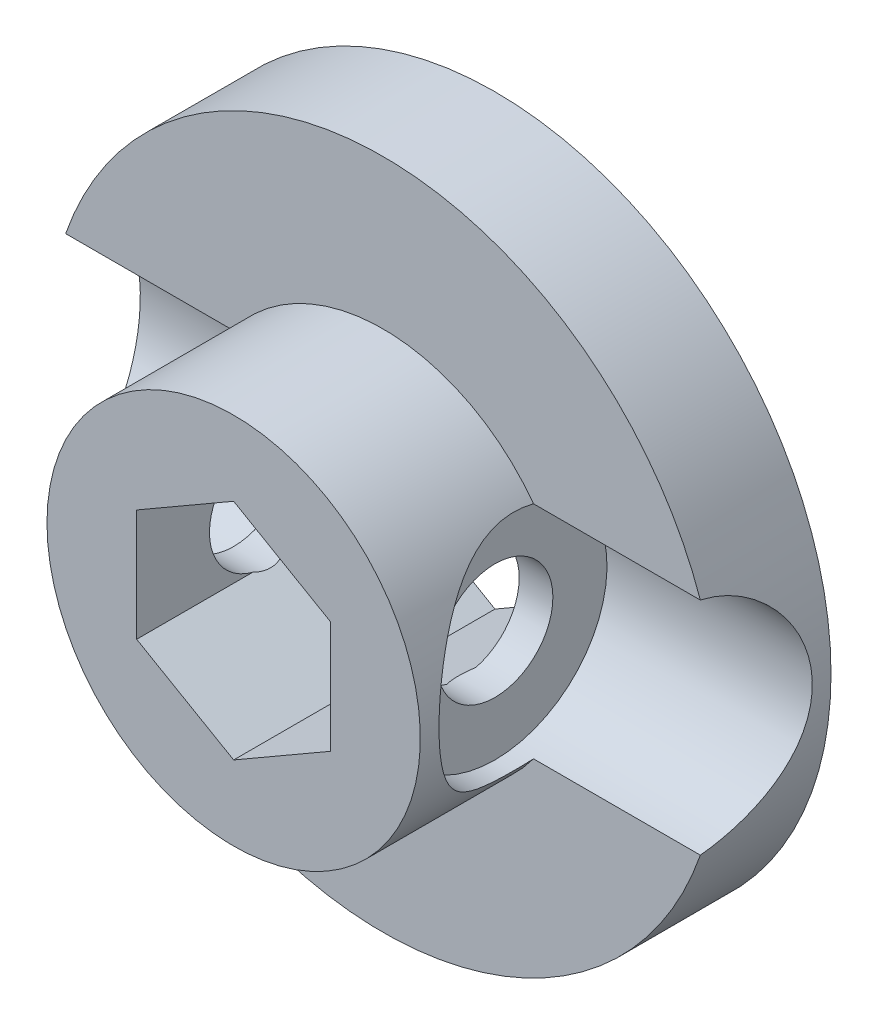
ISO-10303-21;
HEADER;
FILE_DESCRIPTION(('STEP AP214'),'2;1');
FILE_NAME('part.step','',(''),(''),'','','');
FILE_SCHEMA(('AUTOMOTIVE_DESIGN { 1 0 10303 214 1 1 1 1 }'));
ENDSEC;
DATA;
#1=APPLICATION_CONTEXT('core data for automotive mechanical design processes');
#2=APPLICATION_PROTOCOL_DEFINITION('international standard','automotive_design',2000,#1);
#3=PRODUCT_CONTEXT('',#1,'mechanical');
#4=PRODUCT('Part','Part','',(#3));
#5=PRODUCT_RELATED_PRODUCT_CATEGORY('part','',(#4));
#6=PRODUCT_DEFINITION_FORMATION('','',#4);
#7=PRODUCT_DEFINITION_CONTEXT('part definition',#1,'design');
#8=PRODUCT_DEFINITION('design','',#6,#7);
#9=PRODUCT_DEFINITION_SHAPE('','',#8);
#10=(LENGTH_UNIT() NAMED_UNIT(*) SI_UNIT(.MILLI.,.METRE.));
#11=(NAMED_UNIT(*) PLANE_ANGLE_UNIT() SI_UNIT($,.RADIAN.));
#12=(NAMED_UNIT(*) SI_UNIT($,.STERADIAN.) SOLID_ANGLE_UNIT());
#13=UNCERTAINTY_MEASURE_WITH_UNIT(LENGTH_MEASURE(1.E-05),#10,'distance_accuracy_value','');
#14=(GEOMETRIC_REPRESENTATION_CONTEXT(3) GLOBAL_UNCERTAINTY_ASSIGNED_CONTEXT((#13)) GLOBAL_UNIT_ASSIGNED_CONTEXT((#10,
#11,#12)) REPRESENTATION_CONTEXT('',''));
#15=CARTESIAN_POINT('',(0.,0.,0.));
#16=DIRECTION('',(0.,0.,1.));
#17=DIRECTION('',(1.,0.,0.));
#18=AXIS2_PLACEMENT_3D('',#15,#16,#17);
#19=CARTESIAN_POINT('',(0.,0.,3.));
#20=DIRECTION('',(0.,0.,1.));
#21=DIRECTION('',(1.,0.,0.));
#22=AXIS2_PLACEMENT_3D('',#19,#20,#21);
#23=PLANE('',#22);
#24=DIRECTION('',(-1.,0.,0.));
#25=VECTOR('',#24,1.);
#26=CARTESIAN_POINT('',(9.,2.95803989154981,3.));
#27=LINE('',#26,#25);
#28=CARTESIAN_POINT('',(8.5,2.95803989154981,3.));
#29=VERTEX_POINT('',#28);
#30=CARTESIAN_POINT('',(4.03112887414927,2.95803989154981,3.));
#31=VERTEX_POINT('',#30);
#32=EDGE_CURVE('E146',#29,#31,#27,.T.);
#33=ORIENTED_EDGE('',*,*,#32,.F.);
#34=CARTESIAN_POINT('',(0.,0.,3.));
#35=DIRECTION('',(0.,0.,1.));
#36=DIRECTION('',(1.,0.,0.));
#37=AXIS2_PLACEMENT_3D('',#34,#35,#36);
#38=CIRCLE('',#37,9.);
#39=CARTESIAN_POINT('',(-8.5,2.95803989154981,3.));
#40=VERTEX_POINT('',#39);
#41=EDGE_CURVE('E155',#29,#40,#38,.T.);
#42=ORIENTED_EDGE('',*,*,#41,.T.);
#43=DIRECTION('',(1.,0.,0.));
#44=VECTOR('',#43,1.);
#45=CARTESIAN_POINT('',(-9.,2.95803989154981,3.));
#46=LINE('',#45,#44);
#47=CARTESIAN_POINT('',(-4.03112887414927,2.95803989154981,3.));
#48=VERTEX_POINT('',#47);
#49=EDGE_CURVE('E181',#40,#48,#46,.T.);
#50=ORIENTED_EDGE('',*,*,#49,.T.);
#51=CARTESIAN_POINT('',(0.,0.,3.));
#52=DIRECTION('',(0.,0.,1.));
#53=DIRECTION('',(1.,0.,0.));
#54=AXIS2_PLACEMENT_3D('',#51,#52,#53);
#55=CIRCLE('',#54,5.);
#56=EDGE_CURVE('E157',#31,#48,#55,.T.);
#57=ORIENTED_EDGE('',*,*,#56,.F.);
#58=EDGE_LOOP('',(#33,#42,#50,#57));
#59=FACE_BOUND('',#58,.T.);
#60=ADVANCED_FACE('F39',(#59),#23,.T.);
#61=DIRECTION('',(-1.,0.,0.));
#62=VECTOR('',#61,1.);
#63=CARTESIAN_POINT('',(9.,-2.95803989154981,3.));
#64=LINE('',#63,#62);
#65=CARTESIAN_POINT('',(4.03112887414927,-2.95803989154981,3.));
#66=VERTEX_POINT('',#65);
#67=CARTESIAN_POINT('',(8.5,-2.95803989154981,3.));
#68=VERTEX_POINT('',#67);
#69=EDGE_CURVE('E61',#66,#68,#64,.F.);
#70=ORIENTED_EDGE('',*,*,#69,.F.);
#71=CARTESIAN_POINT('',(-4.03112887414927,-2.95803989154981,3.));
#72=VERTEX_POINT('',#71);
#73=EDGE_CURVE('E172',#72,#66,#55,.T.);
#74=ORIENTED_EDGE('',*,*,#73,.F.);
#75=DIRECTION('',(1.,0.,0.));
#76=VECTOR('',#75,1.);
#77=CARTESIAN_POINT('',(-9.,-2.95803989154981,3.));
#78=LINE('',#77,#76);
#79=CARTESIAN_POINT('',(-8.5,-2.95803989154981,3.));
#80=VERTEX_POINT('',#79);
#81=EDGE_CURVE('E213',#72,#80,#78,.F.);
#82=ORIENTED_EDGE('',*,*,#81,.T.);
#83=EDGE_CURVE('E163',#80,#68,#38,.T.);
#84=ORIENTED_EDGE('',*,*,#83,.T.);
#85=EDGE_LOOP('',(#70,#74,#82,#84));
#86=FACE_BOUND('',#85,.T.);
#87=ADVANCED_FACE('F221',(#86),#23,.T.);
#88=CARTESIAN_POINT('',(0.,0.,7.));
#89=DIRECTION('',(0.,0.,-1.));
#90=DIRECTION('',(-1.,0.,0.));
#91=AXIS2_PLACEMENT_3D('',#88,#89,#90);
#92=CYLINDRICAL_SURFACE('',#91,5.);
#93=CARTESIAN_POINT('',(4.03112887414927,2.95803989154981,3.));
#94=CARTESIAN_POINT('',(4.0224914030464,2.96979154699721,3.06944528305734));
#95=CARTESIAN_POINT('',(4.01558872595093,2.97910881902398,3.13952662218648));
#96=CARTESIAN_POINT('',(4.00541215136453,2.99278743942639,3.28042589592678));
#97=CARTESIAN_POINT('',(4.00213799147534,2.99714914616708,3.35124377690061));
#98=CARTESIAN_POINT('',(3.99938500413336,3.00081966242387,3.49264618993183));
#99=CARTESIAN_POINT('',(3.99988251208713,3.00015997757542,3.56322940162775));
#100=CARTESIAN_POINT('',(4.00458037745119,2.9938848899988,3.70402726213926));
#101=CARTESIAN_POINT('',(4.00878046264329,2.98826985159448,3.77424193766835));
#102=CARTESIAN_POINT('',(4.02673813202545,2.96409003540944,3.98357232330201));
#103=CARTESIAN_POINT('',(4.04585154639428,2.9381929085914,4.12147165655781));
#104=CARTESIAN_POINT('',(4.09574519801718,2.86821754308801,4.39034773416502));
#105=CARTESIAN_POINT('',(4.12654005890638,2.82411650937802,4.52131556604238));
#106=CARTESIAN_POINT('',(4.19799008442018,2.71684066536066,4.78038801205322));
#107=CARTESIAN_POINT('',(4.23905845345918,2.65282852106513,4.90802865652525));
#108=CARTESIAN_POINT('',(4.32612938849778,2.50832999505557,5.15178225293992));
#109=CARTESIAN_POINT('',(4.37213509028533,2.42783311376718,5.26788778751424));
#110=CARTESIAN_POINT('',(4.47453294384668,2.23444556390111,5.50887230519121));
#111=CARTESIAN_POINT('',(4.53119837937912,2.11829865348616,5.63103413093234));
#112=CARTESIAN_POINT('',(4.64077682469488,1.86602949990418,5.85506987137566));
#113=CARTESIAN_POINT('',(4.69368785558352,1.72989683684297,5.9569331373917));
#114=CARTESIAN_POINT('',(4.76731230069272,1.50966593106158,6.09399601642413));
#115=CARTESIAN_POINT('',(4.79130833456542,1.43187794975834,6.13775577768105));
#116=CARTESIAN_POINT('',(4.83620490784229,1.27200606812126,6.21845661803646));
#117=CARTESIAN_POINT('',(4.85710699109236,1.18992433818098,6.25540110016298));
#118=CARTESIAN_POINT('',(4.8951753971062,1.02208566286525,6.32196492419137));
#119=CARTESIAN_POINT('',(4.91234476108695,0.936331778070927,6.35159023206372));
#120=CARTESIAN_POINT('',(4.94241768206224,0.761801665335096,6.40308984682478));
#121=CARTESIAN_POINT('',(4.9553220540364,0.673026018389772,6.42496563459458));
#122=CARTESIAN_POINT('',(4.97507993760201,0.504789144789042,6.45830619919011));
#123=CARTESIAN_POINT('',(4.98249554714237,0.425585373903081,6.47074344437651));
#124=CARTESIAN_POINT('',(4.99355131887863,0.266143566541889,6.48924909532056));
#125=CARTESIAN_POINT('',(4.99719019982727,0.185905188418343,6.49531533973788));
#126=CARTESIAN_POINT('',(5.00058166890333,0.0251816970941429,6.5009703720219));
#127=CARTESIAN_POINT('',(5.00033754551395,-0.0553031496169651,6.50056464094857));
#128=CARTESIAN_POINT('',(4.99598462162264,-0.215885239845372,6.49330363139187));
#129=CARTESIAN_POINT('',(4.9918744195207,-0.295982332201062,6.48644601385501));
#130=CARTESIAN_POINT('',(4.97502379609621,-0.519512183504391,6.4582261718612));
#131=CARTESIAN_POINT('',(4.95799237099146,-0.661788022221228,6.42961926851408));
#132=CARTESIAN_POINT('',(4.91304322691874,-0.939041839469729,6.35288397585137));
#133=CARTESIAN_POINT('',(4.88512388792871,-1.07401872857975,6.30475268144203));
#134=CARTESIAN_POINT('',(4.81908023750533,-1.34020201734214,6.18811386740655));
#135=CARTESIAN_POINT('',(4.78053469956429,-1.47092591136596,6.11874815440009));
#136=CARTESIAN_POINT('',(4.69692534679079,-1.71933287180035,5.96281153996099));
#137=CARTESIAN_POINT('',(4.651858749928,-1.83701033427322,5.8762332893477));
#138=CARTESIAN_POINT('',(4.55218843588751,-2.07269153781582,5.67509694794003));
#139=CARTESIAN_POINT('',(4.49711567210005,-2.18862953093591,5.55834470188378));
#140=CARTESIAN_POINT('',(4.38782407137135,-2.40025332012209,5.3071635916286));
#141=CARTESIAN_POINT('',(4.33360650893937,-2.49591112721211,5.1727107077732));
#142=CARTESIAN_POINT('',(4.22779799264364,-2.67152681603645,4.87650896547749));
#143=CARTESIAN_POINT('',(4.17675212418774,-2.74964957420478,4.71344327266168));
#144=CARTESIAN_POINT('',(4.11225867939082,-2.844432113508,4.45784577665522));
#145=CARTESIAN_POINT('',(4.09278025870929,-2.87228422261218,4.37086043184501));
#146=CARTESIAN_POINT('',(4.0587986213779,-2.92010403934882,4.19382427385399));
#147=CARTESIAN_POINT('',(4.04429292545553,-2.94007567673382,4.1037750129528));
#148=CARTESIAN_POINT('',(4.0156788677486,-2.97912794090591,3.87851818368809));
#149=CARTESIAN_POINT('',(4.00496497611937,-2.99337327267789,3.74198770494341));
#150=CARTESIAN_POINT('',(3.99779161183097,-3.00294951438197,3.46804366577511));
#151=CARTESIAN_POINT('',(4.00130717107191,-2.99831355480562,3.330632074201));
#152=CARTESIAN_POINT('',(4.01410440204651,-2.98110255664794,3.16218324481443));
#153=CARTESIAN_POINT('',(4.01698476873059,-2.97722339908272,3.1295642018458));
#154=CARTESIAN_POINT('',(4.02349951974881,-2.96841470242275,3.06458991737443));
#155=CARTESIAN_POINT('',(4.02713286158075,-2.96348661532967,3.03223437475055));
#156=CARTESIAN_POINT('',(4.03112887414927,-2.95803989154981,3.));
#157=B_SPLINE_CURVE_WITH_KNOTS('',3,(#93,#94,#95,#96,#97,#98,#99,#100,#101,#102,#103,#104,#105,
#106,#107,#108,#109,#110,#111,#112,#113,#114,#115,#116,#117,#118,#119,#120,#121,#122,#123,#124,
#125,#126,#127,#128,#129,#130,#131,#132,#133,#134,#135,#136,#137,#138,#139,#140,#141,#142,#143,
#144,#145,#146,#147,#148,#149,#150,#151,#152,#153,#154,#155,#156),.UNSPECIFIED.,.F.,.F.,(4,2,2,
2,2,2,2,2,2,2,2,2,2,2,2,2,2,2,2,2,2,2,2,2,2,2,2,2,2,2,2,4),(0.,0.212827448195354,
0.425639504649748,0.637117423613317,0.848579795747996,1.27121660892695,1.69438426331692,
2.13853441992913,2.58296835256806,3.11422579360384,3.64576120442535,3.92268888565897,
4.19947791392489,4.47604057729747,4.75255036286367,4.99376606168467,5.235063565704,
5.47615672781582,5.71733732903573,6.15353635001812,6.58980029820499,7.04675694671553,
7.50390912114691,8.02226770826377,8.5413370983622,9.10137639257819,9.38111195205308,
9.66070783904922,10.0717818160154,10.4821348036206,10.581045441794,10.6798200412024),.UNSPECIFIED.);
#158=EDGE_CURVE('E159',#31,#66,#157,.T.);
#159=ORIENTED_EDGE('',*,*,#158,.F.);
#160=ORIENTED_EDGE('',*,*,#56,.T.);
#161=CARTESIAN_POINT('',(-4.03112887414927,2.95803989154981,3.));
#162=CARTESIAN_POINT('',(-4.0224914030464,2.96979154699721,3.06944528305734));
#163=CARTESIAN_POINT('',(-4.01558872595093,2.97910881902398,3.13952662218648));
#164=CARTESIAN_POINT('',(-4.00541215136453,2.99278743942639,3.28042589592678));
#165=CARTESIAN_POINT('',(-4.00213799147534,2.99714914616708,3.35124377690061));
#166=CARTESIAN_POINT('',(-3.99938500413336,3.00081966242387,3.49264618993183));
#167=CARTESIAN_POINT('',(-3.99988251208713,3.00015997757542,3.56322940162775));
#168=CARTESIAN_POINT('',(-4.00458037745119,2.9938848899988,3.70402726213926));
#169=CARTESIAN_POINT('',(-4.00878046264329,2.98826985159448,3.77424193766835));
#170=CARTESIAN_POINT('',(-4.02673813202545,2.96409003540944,3.98357232330201));
#171=CARTESIAN_POINT('',(-4.04585154639428,2.9381929085914,4.12147165655781));
#172=CARTESIAN_POINT('',(-4.09574519801718,2.86821754308802,4.39034773416502));
#173=CARTESIAN_POINT('',(-4.12654005890638,2.82411650937802,4.52131556604238));
#174=CARTESIAN_POINT('',(-4.19799008442018,2.71684066536066,4.78038801205322));
#175=CARTESIAN_POINT('',(-4.23905845345918,2.65282852106513,4.90802865652525));
#176=CARTESIAN_POINT('',(-4.32612938849778,2.50832999505558,5.15178225293992));
#177=CARTESIAN_POINT('',(-4.37213509028533,2.42783311376718,5.26788778751424));
#178=CARTESIAN_POINT('',(-4.47453294384668,2.23444556390111,5.50887230519121));
#179=CARTESIAN_POINT('',(-4.53119837937912,2.11829865348616,5.63103413093234));
#180=CARTESIAN_POINT('',(-4.64077682469488,1.86602949990418,5.85506987137566));
#181=CARTESIAN_POINT('',(-4.69368785558352,1.72989683684297,5.9569331373917));
#182=CARTESIAN_POINT('',(-4.76731230069272,1.50966593106158,6.09399601642413));
#183=CARTESIAN_POINT('',(-4.79130833456542,1.43187794975834,6.13775577768105));
#184=CARTESIAN_POINT('',(-4.83620490784229,1.27200606812126,6.21845661803646));
#185=CARTESIAN_POINT('',(-4.85710699109236,1.18992433818098,6.25540110016298));
#186=CARTESIAN_POINT('',(-4.8951753971062,1.02208566286525,6.32196492419137));
#187=CARTESIAN_POINT('',(-4.91234476108695,0.936331778070928,6.35159023206372));
#188=CARTESIAN_POINT('',(-4.94241768206224,0.761801665335097,6.40308984682478));
#189=CARTESIAN_POINT('',(-4.9553220540364,0.673026018389773,6.42496563459458));
#190=CARTESIAN_POINT('',(-4.97507993760202,0.504789144789043,6.45830619919011));
#191=CARTESIAN_POINT('',(-4.98249554714237,0.425585373903082,6.4707434443765));
#192=CARTESIAN_POINT('',(-4.99355131887863,0.26614356654189,6.48924909532056));
#193=CARTESIAN_POINT('',(-4.99719019982727,0.185905188418344,6.49531533973788));
#194=CARTESIAN_POINT('',(-5.00058166890333,0.0251816970941439,6.5009703720219));
#195=CARTESIAN_POINT('',(-5.00033754551395,-0.0553031496169641,6.50056464094857));
#196=CARTESIAN_POINT('',(-4.99598462162264,-0.215885239845371,6.49330363139187));
#197=CARTESIAN_POINT('',(-4.9918744195207,-0.295982332201061,6.48644601385501));
#198=CARTESIAN_POINT('',(-4.97502379609621,-0.519512183504391,6.4582261718612));
#199=CARTESIAN_POINT('',(-4.95799237099146,-0.661788022221228,6.42961926851408));
#200=CARTESIAN_POINT('',(-4.91304322691874,-0.939041839469728,6.35288397585137));
#201=CARTESIAN_POINT('',(-4.88512388792871,-1.07401872857975,6.30475268144203));
#202=CARTESIAN_POINT('',(-4.81908023750533,-1.34020201734214,6.18811386740655));
#203=CARTESIAN_POINT('',(-4.78053469956429,-1.47092591136596,6.11874815440009));
#204=CARTESIAN_POINT('',(-4.69692534679079,-1.71933287180035,5.96281153996099));
#205=CARTESIAN_POINT('',(-4.651858749928,-1.83701033427322,5.8762332893477));
#206=CARTESIAN_POINT('',(-4.55218843588751,-2.07269153781582,5.67509694794003));
#207=CARTESIAN_POINT('',(-4.49711567210005,-2.18862953093591,5.55834470188377));
#208=CARTESIAN_POINT('',(-4.38782407137135,-2.40025332012209,5.3071635916286));
#209=CARTESIAN_POINT('',(-4.33360650893937,-2.49591112721211,5.1727107077732));
#210=CARTESIAN_POINT('',(-4.22779799264364,-2.67152681603645,4.87650896547749));
#211=CARTESIAN_POINT('',(-4.17675212418774,-2.74964957420478,4.71344327266168));
#212=CARTESIAN_POINT('',(-4.11225867939082,-2.844432113508,4.45784577665522));
#213=CARTESIAN_POINT('',(-4.09278025870929,-2.87228422261218,4.37086043184501));
#214=CARTESIAN_POINT('',(-4.0587986213779,-2.92010403934882,4.19382427385399));
#215=CARTESIAN_POINT('',(-4.04429292545553,-2.94007567673382,4.1037750129528));
#216=CARTESIAN_POINT('',(-4.0156788677486,-2.97912794090591,3.87851818368809));
#217=CARTESIAN_POINT('',(-4.00496497611937,-2.99337327267789,3.7419877049434));
#218=CARTESIAN_POINT('',(-3.99779161183097,-3.00294951438197,3.46804366577511));
#219=CARTESIAN_POINT('',(-4.00130717107191,-2.99831355480561,3.330632074201));
#220=CARTESIAN_POINT('',(-4.01410440204651,-2.98110255664794,3.16218324481443));
#221=CARTESIAN_POINT('',(-4.01698476873059,-2.97722339908272,3.1295642018458));
#222=CARTESIAN_POINT('',(-4.02349951974881,-2.96841470242275,3.06458991737442));
#223=CARTESIAN_POINT('',(-4.02713286158075,-2.96348661532967,3.03223437475055));
#224=CARTESIAN_POINT('',(-4.03112887414928,-2.95803989154981,3.));
#225=B_SPLINE_CURVE_WITH_KNOTS('',3,(#161,#162,#163,#164,#165,#166,#167,#168,#169,#170,#171,
#172,#173,#174,#175,#176,#177,#178,#179,#180,#181,#182,#183,#184,#185,#186,#187,#188,#189,#190,
#191,#192,#193,#194,#195,#196,#197,#198,#199,#200,#201,#202,#203,#204,#205,#206,#207,#208,#209,
#210,#211,#212,#213,#214,#215,#216,#217,#218,#219,#220,#221,#222,#223,#224),.UNSPECIFIED.,.F.,
.F.,(4,2,2,2,2,2,2,2,2,2,2,2,2,2,2,2,2,2,2,2,2,2,2,2,2,2,2,2,2,2,2,4),(0.,0.212827448195354,
0.425639504649747,0.637117423613317,0.848579795747996,1.27121660892695,1.69438426331692,
2.13853441992913,2.58296835256806,3.11422579360384,3.64576120442536,3.92268888565897,
4.19947791392489,4.47604057729747,4.75255036286367,4.99376606168467,5.235063565704,
5.47615672781582,5.71733732903573,6.15353635001812,6.58980029820499,7.04675694671553,
7.50390912114691,8.02226770826377,8.54133709836219,9.10137639257819,9.38111195205308,
9.66070783904922,10.0717818160154,10.4821348036206,10.581045441794,10.6798200412024),.UNSPECIFIED.);
#226=EDGE_CURVE('E202',#48,#72,#225,.T.);
#227=ORIENTED_EDGE('',*,*,#226,.T.);
#228=ORIENTED_EDGE('',*,*,#73,.T.);
#229=EDGE_LOOP('',(#159,#160,#227,#228));
#230=FACE_BOUND('',#229,.T.);
#231=CARTESIAN_POINT('',(0.,0.,7.));
#232=DIRECTION('',(0.,0.,-1.));
#233=DIRECTION('',(-1.,0.,0.));
#234=AXIS2_PLACEMENT_3D('',#231,#232,#233);
#235=CIRCLE('',#234,5.);
#236=CARTESIAN_POINT('',(-5.,0.,7.));
#237=VERTEX_POINT('',#236);
#238=EDGE_CURVE('E259',#237,#237,#235,.T.);
#239=ORIENTED_EDGE('',*,*,#238,.T.);
#240=EDGE_LOOP('',(#239));
#241=FACE_BOUND('',#240,.T.);
#242=ADVANCED_FACE('F216',(#230,#241),#92,.T.);
#243=CARTESIAN_POINT('',(0.,0.,3.));
#244=DIRECTION('',(0.,0.,-1.));
#245=DIRECTION('',(-1.,0.,0.));
#246=AXIS2_PLACEMENT_3D('',#243,#244,#245);
#247=CYLINDRICAL_SURFACE('',#246,9.);
#248=CARTESIAN_POINT('',(0.,0.,0.));
#249=DIRECTION('',(0.,0.,1.));
#250=DIRECTION('',(1.,0.,0.));
#251=AXIS2_PLACEMENT_3D('',#248,#249,#250);
#252=CIRCLE('',#251,9.);
#253=CARTESIAN_POINT('',(9.,0.,0.));
#254=VERTEX_POINT('',#253);
#255=EDGE_CURVE('E164',#254,#254,#252,.T.);
#256=ORIENTED_EDGE('',*,*,#255,.T.);
#257=EDGE_LOOP('',(#256));
#258=FACE_BOUND('',#257,.T.);
#259=ORIENTED_EDGE('',*,*,#41,.F.);
#260=CARTESIAN_POINT('',(8.5,2.95803989154981,3.));
#261=CARTESIAN_POINT('',(8.50484434984609,2.94409665304984,2.91745336516649));
#262=CARTESIAN_POINT('',(8.51087022215065,2.92669328785096,2.83557442476058));
#263=CARTESIAN_POINT('',(8.52503628377814,2.88518158318297,2.67375106510852));
#264=CARTESIAN_POINT('',(8.53317571463712,2.86107564875434,2.59380596311937));
#265=CARTESIAN_POINT('',(8.55130189142601,2.80643041531197,2.43658111907064));
#266=CARTESIAN_POINT('',(8.56128409012273,2.77590692711056,2.35929535995488));
#267=CARTESIAN_POINT('',(8.58279538385141,2.70866589064533,2.20771039263575));
#268=CARTESIAN_POINT('',(8.59432458739396,2.67194790783845,2.1334113944064));
#269=CARTESIAN_POINT('',(8.63070999513529,2.55298281096735,1.91585069083158));
#270=CARTESIAN_POINT('',(8.65739916936407,2.46182373095981,1.77763718092215));
#271=CARTESIAN_POINT('',(8.71269884424846,2.25831344640571,1.51826980057663));
#272=CARTESIAN_POINT('',(8.74131044698508,2.14595001801519,1.39712584107486));
#273=CARTESIAN_POINT('',(8.79837635503016,1.8987256952397,1.17109959274229));
#274=CARTESIAN_POINT('',(8.8267948649623,1.76324885253934,1.06687928571112));
#275=CARTESIAN_POINT('',(8.87934532598218,1.47597938059666,0.882635544010506));
#276=CARTESIAN_POINT('',(8.90347774331078,1.32418852887796,0.802609476827556));
#277=CARTESIAN_POINT('',(8.94455237441434,1.00986883567296,0.669987952211319));
#278=CARTESIAN_POINT('',(8.96156176552451,0.847457830494943,0.617135090942082));
#279=CARTESIAN_POINT('',(8.98677100550338,0.515388741907487,0.539693746310798));
#280=CARTESIAN_POINT('',(8.99497405797661,0.345733317270847,0.515094984333455));
#281=CARTESIAN_POINT('',(9.00146087951718,0.0125849565266304,0.495608587596124));
#282=CARTESIAN_POINT('',(9.0001937062476,-0.150821806143008,0.499375957724622));
#283=CARTESIAN_POINT('',(8.9889393963535,-0.474550257425366,0.533303891438762));
#284=CARTESIAN_POINT('',(8.97895276526572,-0.634872124343434,0.563462924888684));
#285=CARTESIAN_POINT('',(8.95150589860564,-0.945841492081693,0.648502123476204));
#286=CARTESIAN_POINT('',(8.93414478615762,-1.09658786335558,0.703054898416778));
#287=CARTESIAN_POINT('',(8.89371117774922,-1.38686774215771,0.835036254007887));
#288=CARTESIAN_POINT('',(8.87063778929311,-1.52639949297757,0.912468409738));
#289=CARTESIAN_POINT('',(8.82005818022539,-1.79614534168054,1.09145977646724));
#290=CARTESIAN_POINT('',(8.79241529847313,-1.92579239456887,1.193834457274));
#291=CARTESIAN_POINT('',(8.73621346969565,-2.16653867251117,1.41836125715136));
#292=CARTESIAN_POINT('',(8.70765401324866,-2.27762736251726,1.54052453266413));
#293=CARTESIAN_POINT('',(8.65158154951258,-2.48230517250465,1.80665709239161));
#294=CARTESIAN_POINT('',(8.62414931898778,-2.57507073727825,1.9512777119155));
#295=CARTESIAN_POINT('',(8.57485210075449,-2.7347644768598,2.25486289690757));
#296=CARTESIAN_POINT('',(8.55297780940818,-2.80173592764418,2.41380288026594));
#297=CARTESIAN_POINT('',(8.52782017544184,-2.87694608160986,2.64650139012766));
#298=CARTESIAN_POINT('',(8.52110409622321,-2.89674431861031,2.71632226849309));
#299=CARTESIAN_POINT('',(8.50930065111175,-2.93123253173945,2.85725357886033));
#300=CARTESIAN_POINT('',(8.50421121255045,-2.94592901061215,2.92836224682381));
#301=CARTESIAN_POINT('',(8.5,-2.95803989154981,3.));
#302=B_SPLINE_CURVE_WITH_KNOTS('',3,(#260,#261,#262,#263,#264,#265,#266,#267,#268,#269,#270,
#271,#272,#273,#274,#275,#276,#277,#278,#279,#280,#281,#282,#283,#284,#285,#286,#287,#288,#289,
#290,#291,#292,#293,#294,#295,#296,#297,#298,#299,#300,#301),.UNSPECIFIED.,.F.,.F.,(4,2,2,2,2,2,
2,2,2,2,2,2,2,2,2,2,2,2,2,2,4),(0.,0.251465509250746,0.502840902912748,0.75360409618288,
1.00438488778136,1.50503614112024,2.00597689554992,2.52331264365625,3.04059208150444,
3.55287676171393,4.06497501776914,4.55295024632079,5.04089718492145,5.5224832399661,
6.00414458637483,6.50438575573954,7.00490993969667,7.52441852130478,8.04305166263465,
8.26152996554679,8.47972876278001),.UNSPECIFIED.);
#303=EDGE_CURVE('E11',#29,#68,#302,.T.);
#304=ORIENTED_EDGE('',*,*,#303,.T.);
#305=ORIENTED_EDGE('',*,*,#83,.F.);
#306=CARTESIAN_POINT('',(-8.5,2.95803989154981,3.));
#307=CARTESIAN_POINT('',(-8.50484434984609,2.94409665304985,2.91745336516649));
#308=CARTESIAN_POINT('',(-8.51087022215065,2.92669328785096,2.83557442476058));
#309=CARTESIAN_POINT('',(-8.52503628377814,2.88518158318297,2.67375106510852));
#310=CARTESIAN_POINT('',(-8.53317571463712,2.86107564875434,2.59380596311937));
#311=CARTESIAN_POINT('',(-8.55130189142601,2.80643041531197,2.43658111907064));
#312=CARTESIAN_POINT('',(-8.56128409012273,2.77590692711056,2.35929535995488));
#313=CARTESIAN_POINT('',(-8.58279538385141,2.70866589064533,2.20771039263575));
#314=CARTESIAN_POINT('',(-8.59432458739396,2.67194790783845,2.1334113944064));
#315=CARTESIAN_POINT('',(-8.63070999513529,2.55298281096736,1.91585069083158));
#316=CARTESIAN_POINT('',(-8.65739916936407,2.46182373095982,1.77763718092215));
#317=CARTESIAN_POINT('',(-8.71269884424846,2.25831344640572,1.51826980057663));
#318=CARTESIAN_POINT('',(-8.74131044698508,2.14595001801519,1.39712584107486));
#319=CARTESIAN_POINT('',(-8.79837635503016,1.89872569523971,1.17109959274229));
#320=CARTESIAN_POINT('',(-8.8267948649623,1.76324885253935,1.06687928571112));
#321=CARTESIAN_POINT('',(-8.87934532598218,1.47597938059666,0.882635544010506));
#322=CARTESIAN_POINT('',(-8.90347774331078,1.32418852887796,0.802609476827557));
#323=CARTESIAN_POINT('',(-8.94455237441434,1.00986883567296,0.669987952211319));
#324=CARTESIAN_POINT('',(-8.96156176552451,0.847457830494946,0.617135090942082));
#325=CARTESIAN_POINT('',(-8.98677100550338,0.51538874190749,0.539693746310798));
#326=CARTESIAN_POINT('',(-8.99497405797662,0.34573331727085,0.515094984333455));
#327=CARTESIAN_POINT('',(-9.00146087951718,0.0125849565266335,0.495608587596124));
#328=CARTESIAN_POINT('',(-9.0001937062476,-0.150821806143005,0.499375957724622));
#329=CARTESIAN_POINT('',(-8.9889393963535,-0.474550257425363,0.533303891438762));
#330=CARTESIAN_POINT('',(-8.97895276526572,-0.634872124343431,0.563462924888684));
#331=CARTESIAN_POINT('',(-8.95150589860564,-0.945841492081691,0.648502123476204));
#332=CARTESIAN_POINT('',(-8.93414478615762,-1.09658786335558,0.703054898416778));
#333=CARTESIAN_POINT('',(-8.89371117774922,-1.3868677421577,0.835036254007887));
#334=CARTESIAN_POINT('',(-8.87063778929311,-1.52639949297757,0.912468409738001));
#335=CARTESIAN_POINT('',(-8.82005818022539,-1.79614534168054,1.09145977646724));
#336=CARTESIAN_POINT('',(-8.79241529847313,-1.92579239456887,1.193834457274));
#337=CARTESIAN_POINT('',(-8.73621346969565,-2.16653867251117,1.41836125715136));
#338=CARTESIAN_POINT('',(-8.70765401324866,-2.27762736251726,1.54052453266413));
#339=CARTESIAN_POINT('',(-8.65158154951258,-2.48230517250465,1.80665709239161));
#340=CARTESIAN_POINT('',(-8.62414931898778,-2.57507073727825,1.9512777119155));
#341=CARTESIAN_POINT('',(-8.57485210075449,-2.7347644768598,2.25486289690757));
#342=CARTESIAN_POINT('',(-8.55297780940818,-2.80173592764418,2.41380288026594));
#343=CARTESIAN_POINT('',(-8.52782017544184,-2.87694608160986,2.64650139012765));
#344=CARTESIAN_POINT('',(-8.52110409622321,-2.89674431861031,2.71632226849309));
#345=CARTESIAN_POINT('',(-8.50930065111175,-2.93123253173945,2.85725357886033));
#346=CARTESIAN_POINT('',(-8.50421121255045,-2.94592901061215,2.92836224682381));
#347=CARTESIAN_POINT('',(-8.5,-2.95803989154981,3.));
#348=B_SPLINE_CURVE_WITH_KNOTS('',3,(#306,#307,#308,#309,#310,#311,#312,#313,#314,#315,#316,
#317,#318,#319,#320,#321,#322,#323,#324,#325,#326,#327,#328,#329,#330,#331,#332,#333,#334,#335,
#336,#337,#338,#339,#340,#341,#342,#343,#344,#345,#346,#347),.UNSPECIFIED.,.F.,.F.,(4,2,2,2,2,2,
2,2,2,2,2,2,2,2,2,2,2,2,2,2,4),(0.,0.251465509250745,0.502840902912747,0.753604096182879,
1.00438488778136,1.50503614112024,2.00597689554992,2.52331264365625,3.04059208150444,
3.55287676171393,4.06497501776914,4.55295024632079,5.04089718492145,5.5224832399661,
6.00414458637483,6.50438575573954,7.00490993969667,7.52441852130477,8.04305166263464,
8.26152996554679,8.47972876278001),.UNSPECIFIED.);
#349=EDGE_CURVE('E54',#40,#80,#348,.T.);
#350=ORIENTED_EDGE('',*,*,#349,.F.);
#351=EDGE_LOOP('',(#259,#304,#305,#350));
#352=FACE_BOUND('',#351,.T.);
#353=ADVANCED_FACE('F41',(#258,#352),#247,.T.);
#354=CARTESIAN_POINT('',(-5.,0.,3.5));
#355=DIRECTION('',(1.,0.,0.));
#356=DIRECTION('',(0.,1.,0.));
#357=AXIS2_PLACEMENT_3D('',#354,#355,#356);
#358=CYLINDRICAL_SURFACE('',#357,1.55);
#359=CARTESIAN_POINT('',(-5.19615242270664,0.,3.5));
#360=DIRECTION('',(-0.499999999999999,0.866025403784439,0.));
#361=DIRECTION('',(0.866025403784439,0.5,0.));
#362=AXIS2_PLACEMENT_3D('',#359,#360,#361);
#363=ELLIPSE('',#362,3.1,1.55);
#364=CARTESIAN_POINT('',(-2.59807621135331,1.5,3.10948751620468));
#365=VERTEX_POINT('',#364);
#366=CARTESIAN_POINT('',(-2.59807621135331,1.5,3.89051248379532));
#367=VERTEX_POINT('',#366);
#368=EDGE_CURVE('E317',#365,#367,#363,.F.);
#369=ORIENTED_EDGE('',*,*,#368,.T.);
#370=CARTESIAN_POINT('',(-2.59807621135332,0.,3.5));
#371=DIRECTION('',(-1.,0.,0.));
#372=DIRECTION('',(0.,-1.,0.));
#373=AXIS2_PLACEMENT_3D('',#370,#371,#372);
#374=CIRCLE('',#373,1.55);
#375=CARTESIAN_POINT('',(-2.59807621135332,-1.49999999999998,3.8905124837954));
#376=VERTEX_POINT('',#375);
#377=EDGE_CURVE('E68',#367,#376,#374,.F.);
#378=ORIENTED_EDGE('',*,*,#377,.T.);
#379=CARTESIAN_POINT('',(-5.19615242270658,0.,3.5));
#380=DIRECTION('',(-0.500000000000004,-0.866025403784437,0.));
#381=DIRECTION('',(0.866025403784437,-0.500000000000004,0.));
#382=AXIS2_PLACEMENT_3D('',#379,#380,#381);
#383=ELLIPSE('',#382,3.09999999999998,1.55);
#384=CARTESIAN_POINT('',(-2.59807621135332,-1.49999999999998,3.1094875162046));
#385=VERTEX_POINT('',#384);
#386=EDGE_CURVE('E345',#376,#385,#383,.F.);
#387=ORIENTED_EDGE('',*,*,#386,.T.);
#388=EDGE_CURVE('E342',#385,#365,#374,.F.);
#389=ORIENTED_EDGE('',*,*,#388,.T.);
#390=EDGE_LOOP('',(#369,#378,#387,#389));
#391=FACE_BOUND('',#390,.T.);
#392=CARTESIAN_POINT('',(-3.5,0.,3.5));
#393=DIRECTION('',(-1.,0.,0.));
#394=DIRECTION('',(0.,-1.,0.));
#395=AXIS2_PLACEMENT_3D('',#392,#393,#394);
#396=CIRCLE('',#395,1.55);
#397=CARTESIAN_POINT('',(-3.5,-1.55,3.5));
#398=VERTEX_POINT('',#397);
#399=EDGE_CURVE('E177',#398,#398,#396,.T.);
#400=ORIENTED_EDGE('',*,*,#399,.T.);
#401=EDGE_LOOP('',(#400));
#402=FACE_BOUND('',#401,.T.);
#403=ADVANCED_FACE('F198',(#391,#402),#358,.F.);
#404=CARTESIAN_POINT('',(-2.59807621135332,-1.49999999999998,7.));
#405=DIRECTION('',(-1.,0.,0.));
#406=DIRECTION('',(0.,-1.,0.));
#407=AXIS2_PLACEMENT_3D('',#404,#405,#406);
#408=PLANE('',#407);
#409=ORIENTED_EDGE('',*,*,#388,.F.);
#410=DIRECTION('',(0.,0.,-1.));
#411=VECTOR('',#410,1.);
#412=CARTESIAN_POINT('',(-2.59807621135332,-1.49999999999998,7.));
#413=LINE('',#412,#411);
#414=CARTESIAN_POINT('',(-2.59807621135332,-1.49999999999998,0.));
#415=VERTEX_POINT('',#414);
#416=EDGE_CURVE('E288',#385,#415,#413,.T.);
#417=ORIENTED_EDGE('',*,*,#416,.T.);
#418=DIRECTION('',(0.,1.,0.));
#419=VECTOR('',#418,1.);
#420=CARTESIAN_POINT('',(-2.59807621135332,-1.49999999999998,0.));
#421=LINE('',#420,#419);
#422=CARTESIAN_POINT('',(-2.59807621135331,1.5,0.));
#423=VERTEX_POINT('',#422);
#424=EDGE_CURVE('E293',#415,#423,#421,.T.);
#425=ORIENTED_EDGE('',*,*,#424,.T.);
#426=DIRECTION('',(0.,0.,-1.));
#427=VECTOR('',#426,1.);
#428=CARTESIAN_POINT('',(-2.59807621135331,1.5,7.));
#429=LINE('',#428,#427);
#430=EDGE_CURVE('E267',#365,#423,#429,.T.);
#431=ORIENTED_EDGE('',*,*,#430,.F.);
#432=EDGE_LOOP('',(#409,#417,#425,#431));
#433=FACE_BOUND('',#432,.T.);
#434=ADVANCED_FACE('F390',(#433),#408,.F.);
#435=CARTESIAN_POINT('',(2.59807621135333,1.49999999999998,7.));
#436=DIRECTION('',(1.,0.,0.));
#437=DIRECTION('',(0.,1.,0.));
#438=AXIS2_PLACEMENT_3D('',#435,#436,#437);
#439=PLANE('',#438);
#440=CARTESIAN_POINT('',(2.59807621135332,0.,3.5));
#441=DIRECTION('',(1.,0.,0.));
#442=DIRECTION('',(0.,1.,0.));
#443=AXIS2_PLACEMENT_3D('',#440,#441,#442);
#444=CIRCLE('',#443,1.55);
#445=CARTESIAN_POINT('',(2.59807621135333,1.49999999999998,3.10948751620461));
#446=VERTEX_POINT('',#445);
#447=CARTESIAN_POINT('',(2.59807621135331,-1.5,3.10948751620468));
#448=VERTEX_POINT('',#447);
#449=EDGE_CURVE('E349',#446,#448,#444,.F.);
#450=ORIENTED_EDGE('',*,*,#449,.F.);
#451=DIRECTION('',(0.,0.,-1.));
#452=VECTOR('',#451,1.);
#453=CARTESIAN_POINT('',(2.59807621135333,1.49999999999998,7.));
#454=LINE('',#453,#452);
#455=CARTESIAN_POINT('',(2.59807621135333,1.49999999999998,0.));
#456=VERTEX_POINT('',#455);
#457=EDGE_CURVE('E274',#446,#456,#454,.T.);
#458=ORIENTED_EDGE('',*,*,#457,.T.);
#459=DIRECTION('',(0.,-1.,0.));
#460=VECTOR('',#459,1.);
#461=CARTESIAN_POINT('',(2.59807621135333,1.49999999999998,0.));
#462=LINE('',#461,#460);
#463=CARTESIAN_POINT('',(2.59807621135331,-1.5,0.));
#464=VERTEX_POINT('',#463);
#465=EDGE_CURVE('E306',#456,#464,#462,.T.);
#466=ORIENTED_EDGE('',*,*,#465,.T.);
#467=DIRECTION('',(0.,0.,-1.));
#468=VECTOR('',#467,1.);
#469=CARTESIAN_POINT('',(2.59807621135331,-1.5,7.));
#470=LINE('',#469,#468);
#471=EDGE_CURVE('E280',#448,#464,#470,.T.);
#472=ORIENTED_EDGE('',*,*,#471,.F.);
#473=EDGE_LOOP('',(#450,#458,#466,#472));
#474=FACE_BOUND('',#473,.T.);
#475=ADVANCED_FACE('F379',(#474),#439,.F.);
#476=CARTESIAN_POINT('',(0.,0.,0.));
#477=DIRECTION('',(0.,0.,1.));
#478=DIRECTION('',(1.,0.,0.));
#479=AXIS2_PLACEMENT_3D('',#476,#477,#478);
#480=PLANE('',#479);
#481=ORIENTED_EDGE('',*,*,#255,.F.);
#482=EDGE_LOOP('',(#481));
#483=FACE_BOUND('',#482,.T.);
#484=DIRECTION('',(0.866025403784439,0.5,0.));
#485=VECTOR('',#484,1.);
#486=CARTESIAN_POINT('',(-2.59807621135331,1.5,0.));
#487=LINE('',#486,#485);
#488=CARTESIAN_POINT('',(0.,3.,0.));
#489=VERTEX_POINT('',#488);
#490=EDGE_CURVE('E314',#423,#489,#487,.T.);
#491=ORIENTED_EDGE('',*,*,#490,.F.);
#492=ORIENTED_EDGE('',*,*,#424,.F.);
#493=DIRECTION('',(-0.866025403784437,0.500000000000004,0.));
#494=VECTOR('',#493,1.);
#495=CARTESIAN_POINT('',(0.,-3.,0.));
#496=LINE('',#495,#494);
#497=CARTESIAN_POINT('',(0.,-3.,0.));
#498=VERTEX_POINT('',#497);
#499=EDGE_CURVE('E298',#498,#415,#496,.T.);
#500=ORIENTED_EDGE('',*,*,#499,.F.);
#501=DIRECTION('',(-0.866025403784439,-0.499999999999999,0.));
#502=VECTOR('',#501,1.);
#503=CARTESIAN_POINT('',(2.59807621135331,-1.5,0.));
#504=LINE('',#503,#502);
#505=EDGE_CURVE('E302',#464,#498,#504,.T.);
#506=ORIENTED_EDGE('',*,*,#505,.F.);
#507=ORIENTED_EDGE('',*,*,#465,.F.);
#508=DIRECTION('',(0.866025403784437,-0.500000000000003,0.));
#509=VECTOR('',#508,1.);
#510=CARTESIAN_POINT('',(0.,3.,0.));
#511=LINE('',#510,#509);
#512=EDGE_CURVE('E310',#489,#456,#511,.T.);
#513=ORIENTED_EDGE('',*,*,#512,.F.);
#514=EDGE_LOOP('',(#491,#492,#500,#506,#507,#513));
#515=FACE_BOUND('',#514,.T.);
#516=ADVANCED_FACE('F373',(#483,#515),#480,.F.);
#517=CARTESIAN_POINT('',(0.,0.,7.));
#518=DIRECTION('',(0.,0.,-1.));
#519=DIRECTION('',(-1.,0.,0.));
#520=AXIS2_PLACEMENT_3D('',#517,#518,#519);
#521=PLANE('',#520);
#522=DIRECTION('',(0.,1.,0.));
#523=VECTOR('',#522,1.);
#524=CARTESIAN_POINT('',(-2.59807621135332,-1.49999999999998,7.));
#525=LINE('',#524,#523);
#526=CARTESIAN_POINT('',(-2.59807621135332,-1.49999999999998,7.));
#527=VERTEX_POINT('',#526);
#528=CARTESIAN_POINT('',(-2.59807621135331,1.5,7.));
#529=VERTEX_POINT('',#528);
#530=EDGE_CURVE('E275',#527,#529,#525,.T.);
#531=ORIENTED_EDGE('',*,*,#530,.T.);
#532=DIRECTION('',(0.866025403784439,0.5,0.));
#533=VECTOR('',#532,1.);
#534=CARTESIAN_POINT('',(-2.59807621135331,1.5,7.));
#535=LINE('',#534,#533);
#536=CARTESIAN_POINT('',(0.,3.,7.));
#537=VERTEX_POINT('',#536);
#538=EDGE_CURVE('E297',#529,#537,#535,.T.);
#539=ORIENTED_EDGE('',*,*,#538,.T.);
#540=DIRECTION('',(0.866025403784437,-0.500000000000003,0.));
#541=VECTOR('',#540,1.);
#542=CARTESIAN_POINT('',(0.,3.,7.));
#543=LINE('',#542,#541);
#544=CARTESIAN_POINT('',(2.59807621135333,1.49999999999998,7.));
#545=VERTEX_POINT('',#544);
#546=EDGE_CURVE('E333',#537,#545,#543,.T.);
#547=ORIENTED_EDGE('',*,*,#546,.T.);
#548=DIRECTION('',(0.,-1.,0.));
#549=VECTOR('',#548,1.);
#550=CARTESIAN_POINT('',(2.59807621135333,1.49999999999998,7.));
#551=LINE('',#550,#549);
#552=CARTESIAN_POINT('',(2.59807621135331,-1.5,7.));
#553=VERTEX_POINT('',#552);
#554=EDGE_CURVE('E329',#545,#553,#551,.T.);
#555=ORIENTED_EDGE('',*,*,#554,.T.);
#556=DIRECTION('',(-0.866025403784439,-0.499999999999999,0.));
#557=VECTOR('',#556,1.);
#558=CARTESIAN_POINT('',(2.59807621135331,-1.5,7.));
#559=LINE('',#558,#557);
#560=CARTESIAN_POINT('',(0.,-3.,7.));
#561=VERTEX_POINT('',#560);
#562=EDGE_CURVE('E325',#553,#561,#559,.T.);
#563=ORIENTED_EDGE('',*,*,#562,.T.);
#564=DIRECTION('',(-0.866025403784437,0.500000000000004,0.));
#565=VECTOR('',#564,1.);
#566=CARTESIAN_POINT('',(0.,-3.,7.));
#567=LINE('',#566,#565);
#568=EDGE_CURVE('E321',#561,#527,#567,.T.);
#569=ORIENTED_EDGE('',*,*,#568,.T.);
#570=EDGE_LOOP('',(#531,#539,#547,#555,#563,#569));
#571=FACE_BOUND('',#570,.T.);
#572=ORIENTED_EDGE('',*,*,#238,.F.);
#573=EDGE_LOOP('',(#572));
#574=FACE_BOUND('',#573,.T.);
#575=ADVANCED_FACE('F223',(#571,#574),#521,.F.);
#576=CARTESIAN_POINT('',(-2.59807621135331,1.5,7.));
#577=DIRECTION('',(-0.499999999999999,0.866025403784439,0.));
#578=DIRECTION('',(-0.866025403784439,-0.5,0.));
#579=AXIS2_PLACEMENT_3D('',#576,#577,#578);
#580=PLANE('',#579);
#581=ORIENTED_EDGE('',*,*,#368,.F.);
#582=ORIENTED_EDGE('',*,*,#430,.T.);
#583=ORIENTED_EDGE('',*,*,#490,.T.);
#584=DIRECTION('',(0.,0.,-1.));
#585=VECTOR('',#584,1.);
#586=CARTESIAN_POINT('',(0.,3.,7.));
#587=LINE('',#586,#585);
#588=EDGE_CURVE('E270',#537,#489,#587,.T.);
#589=ORIENTED_EDGE('',*,*,#588,.F.);
#590=ORIENTED_EDGE('',*,*,#538,.F.);
#591=EDGE_CURVE('E263',#529,#367,#429,.T.);
#592=ORIENTED_EDGE('',*,*,#591,.T.);
#593=EDGE_LOOP('',(#581,#582,#583,#589,#590,#592));
#594=FACE_BOUND('',#593,.T.);
#595=ADVANCED_FACE('F389',(#594),#580,.F.);
#596=ORIENTED_EDGE('',*,*,#377,.F.);
#597=ORIENTED_EDGE('',*,*,#591,.F.);
#598=ORIENTED_EDGE('',*,*,#530,.F.);
#599=EDGE_CURVE('E289',#527,#376,#413,.T.);
#600=ORIENTED_EDGE('',*,*,#599,.T.);
#601=EDGE_LOOP('',(#596,#597,#598,#600));
#602=FACE_BOUND('',#601,.T.);
#603=ADVANCED_FACE('F400',(#602),#408,.F.);
#604=CARTESIAN_POINT('',(0.,-3.,7.));
#605=DIRECTION('',(-0.500000000000004,-0.866025403784437,0.));
#606=DIRECTION('',(0.866025403784437,-0.500000000000004,0.));
#607=AXIS2_PLACEMENT_3D('',#604,#605,#606);
#608=PLANE('',#607);
#609=ORIENTED_EDGE('',*,*,#386,.F.);
#610=ORIENTED_EDGE('',*,*,#599,.F.);
#611=ORIENTED_EDGE('',*,*,#568,.F.);
#612=DIRECTION('',(0.,0.,-1.));
#613=VECTOR('',#612,1.);
#614=CARTESIAN_POINT('',(0.,-3.,7.));
#615=LINE('',#614,#613);
#616=EDGE_CURVE('E285',#561,#498,#615,.T.);
#617=ORIENTED_EDGE('',*,*,#616,.T.);
#618=ORIENTED_EDGE('',*,*,#499,.T.);
#619=ORIENTED_EDGE('',*,*,#416,.F.);
#620=EDGE_LOOP('',(#609,#610,#611,#617,#618,#619));
#621=FACE_BOUND('',#620,.T.);
#622=ADVANCED_FACE('F397',(#621),#608,.F.);
#623=CARTESIAN_POINT('',(2.59807621135331,-1.5,7.));
#624=DIRECTION('',(0.499999999999999,-0.866025403784439,0.));
#625=DIRECTION('',(0.866025403784439,0.499999999999999,0.));
#626=AXIS2_PLACEMENT_3D('',#623,#624,#625);
#627=PLANE('',#626);
#628=CARTESIAN_POINT('',(5.19615242270664,0.,3.5));
#629=DIRECTION('',(0.499999999999999,-0.866025403784439,0.));
#630=DIRECTION('',(0.866025403784439,0.499999999999999,0.));
#631=AXIS2_PLACEMENT_3D('',#628,#629,#630);
#632=ELLIPSE('',#631,3.1,1.55);
#633=CARTESIAN_POINT('',(2.59807621135331,-1.5,3.89051248379532));
#634=VERTEX_POINT('',#633);
#635=EDGE_CURVE('E347',#448,#634,#632,.F.);
#636=ORIENTED_EDGE('',*,*,#635,.F.);
#637=ORIENTED_EDGE('',*,*,#471,.T.);
#638=ORIENTED_EDGE('',*,*,#505,.T.);
#639=ORIENTED_EDGE('',*,*,#616,.F.);
#640=ORIENTED_EDGE('',*,*,#562,.F.);
#641=EDGE_CURVE('E281',#553,#634,#470,.T.);
#642=ORIENTED_EDGE('',*,*,#641,.T.);
#643=EDGE_LOOP('',(#636,#637,#638,#639,#640,#642));
#644=FACE_BOUND('',#643,.T.);
#645=ADVANCED_FACE('F394',(#644),#627,.F.);
#646=CARTESIAN_POINT('',(2.59807621135333,1.49999999999998,3.89051248379539));
#647=VERTEX_POINT('',#646);
#648=EDGE_CURVE('E212',#634,#647,#444,.F.);
#649=ORIENTED_EDGE('',*,*,#648,.F.);
#650=ORIENTED_EDGE('',*,*,#641,.F.);
#651=ORIENTED_EDGE('',*,*,#554,.F.);
#652=EDGE_CURVE('E276',#545,#647,#454,.T.);
#653=ORIENTED_EDGE('',*,*,#652,.T.);
#654=EDGE_LOOP('',(#649,#650,#651,#653));
#655=FACE_BOUND('',#654,.T.);
#656=ADVANCED_FACE('F363',(#655),#439,.F.);
#657=CARTESIAN_POINT('',(0.,3.,7.));
#658=DIRECTION('',(0.500000000000003,0.866025403784437,0.));
#659=DIRECTION('',(-0.866025403784437,0.500000000000003,0.));
#660=AXIS2_PLACEMENT_3D('',#657,#658,#659);
#661=PLANE('',#660);
#662=CARTESIAN_POINT('',(5.1961524227066,0.,3.5));
#663=DIRECTION('',(0.500000000000003,0.866025403784437,0.));
#664=DIRECTION('',(0.866025403784437,-0.500000000000003,0.));
#665=AXIS2_PLACEMENT_3D('',#662,#663,#664);
#666=ELLIPSE('',#665,3.09999999999998,1.55);
#667=EDGE_CURVE('E168',#647,#446,#666,.F.);
#668=ORIENTED_EDGE('',*,*,#667,.F.);
#669=ORIENTED_EDGE('',*,*,#652,.F.);
#670=ORIENTED_EDGE('',*,*,#546,.F.);
#671=ORIENTED_EDGE('',*,*,#588,.T.);
#672=ORIENTED_EDGE('',*,*,#512,.T.);
#673=ORIENTED_EDGE('',*,*,#457,.F.);
#674=EDGE_LOOP('',(#668,#669,#670,#671,#672,#673));
#675=FACE_BOUND('',#674,.T.);
#676=ADVANCED_FACE('F361',(#675),#661,.F.);
#677=CARTESIAN_POINT('',(3.5,0.,3.5));
#678=DIRECTION('',(-1.,0.,0.));
#679=DIRECTION('',(0.,-1.,0.));
#680=AXIS2_PLACEMENT_3D('',#677,#678,#679);
#681=CIRCLE('',#680,1.55);
#682=CARTESIAN_POINT('',(3.5,-1.55,3.5));
#683=VERTEX_POINT('',#682);
#684=EDGE_CURVE('E189',#683,#683,#681,.T.);
#685=ORIENTED_EDGE('',*,*,#684,.F.);
#686=EDGE_LOOP('',(#685));
#687=FACE_BOUND('',#686,.T.);
#688=ORIENTED_EDGE('',*,*,#635,.T.);
#689=ORIENTED_EDGE('',*,*,#648,.T.);
#690=ORIENTED_EDGE('',*,*,#667,.T.);
#691=ORIENTED_EDGE('',*,*,#449,.T.);
#692=EDGE_LOOP('',(#688,#689,#690,#691));
#693=FACE_BOUND('',#692,.T.);
#694=ADVANCED_FACE('F196',(#687,#693),#358,.F.);
#695=CARTESIAN_POINT('',(-9.,0.,3.5));
#696=DIRECTION('',(1.,0.,0.));
#697=DIRECTION('',(0.,1.,0.));
#698=AXIS2_PLACEMENT_3D('',#695,#696,#697);
#699=CYLINDRICAL_SURFACE('',#698,3.);
#700=ORIENTED_EDGE('',*,*,#49,.F.);
#701=ORIENTED_EDGE('',*,*,#349,.T.);
#702=ORIENTED_EDGE('',*,*,#81,.F.);
#703=ORIENTED_EDGE('',*,*,#226,.F.);
#704=EDGE_LOOP('',(#700,#701,#702,#703));
#705=FACE_BOUND('',#704,.T.);
#706=CARTESIAN_POINT('',(-3.5,0.,3.5));
#707=DIRECTION('',(-1.,0.,0.));
#708=DIRECTION('',(0.,-1.,0.));
#709=AXIS2_PLACEMENT_3D('',#706,#707,#708);
#710=CIRCLE('',#709,3.);
#711=CARTESIAN_POINT('',(-3.5,-3.,3.5));
#712=VERTEX_POINT('',#711);
#713=EDGE_CURVE('E182',#712,#712,#710,.T.);
#714=ORIENTED_EDGE('',*,*,#713,.F.);
#715=EDGE_LOOP('',(#714));
#716=FACE_BOUND('',#715,.T.);
#717=ADVANCED_FACE('F190',(#705,#716),#699,.F.);
#718=CARTESIAN_POINT('',(-3.5,0.,3.5));
#719=DIRECTION('',(-1.,0.,0.));
#720=DIRECTION('',(0.,-1.,0.));
#721=AXIS2_PLACEMENT_3D('',#718,#719,#720);
#722=PLANE('',#721);
#723=ORIENTED_EDGE('',*,*,#399,.F.);
#724=EDGE_LOOP('',(#723));
#725=FACE_BOUND('',#724,.T.);
#726=ORIENTED_EDGE('',*,*,#713,.T.);
#727=EDGE_LOOP('',(#726));
#728=FACE_BOUND('',#727,.T.);
#729=ADVANCED_FACE('F195',(#725,#728),#722,.T.);
#730=CARTESIAN_POINT('',(9.,0.,3.5));
#731=DIRECTION('',(-1.,0.,0.));
#732=DIRECTION('',(0.,-1.,0.));
#733=AXIS2_PLACEMENT_3D('',#730,#731,#732);
#734=CYLINDRICAL_SURFACE('',#733,3.);
#735=ORIENTED_EDGE('',*,*,#158,.T.);
#736=ORIENTED_EDGE('',*,*,#69,.T.);
#737=ORIENTED_EDGE('',*,*,#303,.F.);
#738=ORIENTED_EDGE('',*,*,#32,.T.);
#739=EDGE_LOOP('',(#735,#736,#737,#738));
#740=FACE_BOUND('',#739,.T.);
#741=CARTESIAN_POINT('',(3.5,0.,3.5));
#742=DIRECTION('',(-1.,0.,0.));
#743=DIRECTION('',(0.,-1.,0.));
#744=AXIS2_PLACEMENT_3D('',#741,#742,#743);
#745=CIRCLE('',#744,3.);
#746=CARTESIAN_POINT('',(3.5,-3.,3.5));
#747=VERTEX_POINT('',#746);
#748=EDGE_CURVE('E425',#747,#747,#745,.T.);
#749=ORIENTED_EDGE('',*,*,#748,.T.);
#750=EDGE_LOOP('',(#749));
#751=FACE_BOUND('',#750,.T.);
#752=ADVANCED_FACE('F144',(#740,#751),#734,.F.);
#753=CARTESIAN_POINT('',(3.5,0.,3.5));
#754=DIRECTION('',(-1.,0.,0.));
#755=DIRECTION('',(0.,-1.,0.));
#756=AXIS2_PLACEMENT_3D('',#753,#754,#755);
#757=PLANE('',#756);
#758=ORIENTED_EDGE('',*,*,#684,.T.);
#759=EDGE_LOOP('',(#758));
#760=FACE_BOUND('',#759,.T.);
#761=ORIENTED_EDGE('',*,*,#748,.F.);
#762=EDGE_LOOP('',(#761));
#763=FACE_BOUND('',#762,.T.);
#764=ADVANCED_FACE('F237',(#760,#763),#757,.F.);
#765=CLOSED_SHELL('',(#60,#87,#242,#353,#403,#434,#475,#516,#575,#595,#603,#622,#645,#656,#676,
#694,#717,#729,#752,#764));
#766=MANIFOLD_SOLID_BREP('B2',#765);
#767=ADVANCED_BREP_SHAPE_REPRESENTATION('',(#18,#766),#14);
#768=SHAPE_DEFINITION_REPRESENTATION(#9,#767);
ENDSEC;
END-ISO-10303-21;
